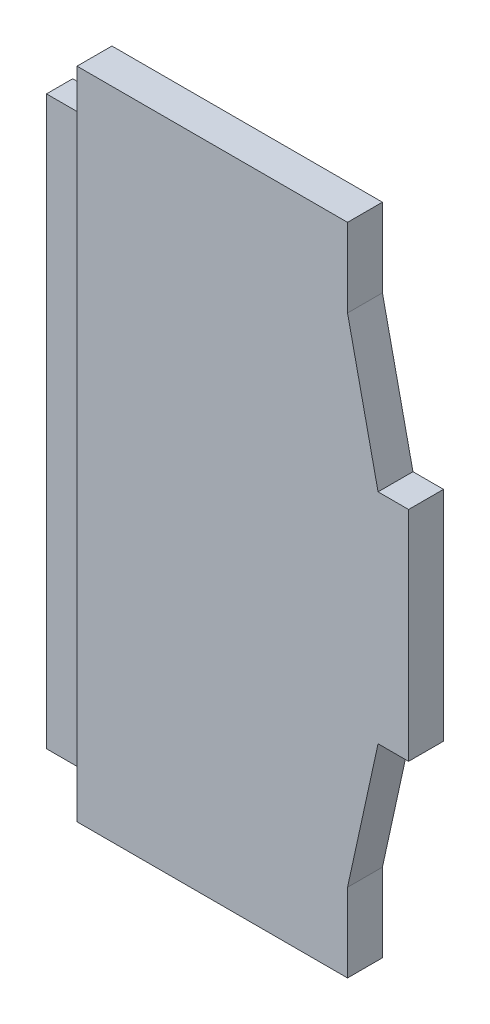
ISO-10303-21;
HEADER;
FILE_DESCRIPTION(('STEP AP214'),'2;1');
FILE_NAME('part.step','',(''),(''),'','','');
FILE_SCHEMA(('AUTOMOTIVE_DESIGN { 1 0 10303 214 1 1 1 1 }'));
ENDSEC;
DATA;
#1=APPLICATION_CONTEXT('core data for automotive mechanical design processes');
#2=APPLICATION_PROTOCOL_DEFINITION('international standard','automotive_design',2000,#1);
#3=PRODUCT_CONTEXT('',#1,'mechanical');
#4=PRODUCT('Part','Part','',(#3));
#5=PRODUCT_RELATED_PRODUCT_CATEGORY('part','',(#4));
#6=PRODUCT_DEFINITION_FORMATION('','',#4);
#7=PRODUCT_DEFINITION_CONTEXT('part definition',#1,'design');
#8=PRODUCT_DEFINITION('design','',#6,#7);
#9=PRODUCT_DEFINITION_SHAPE('','',#8);
#10=(LENGTH_UNIT() NAMED_UNIT(*) SI_UNIT(.MILLI.,.METRE.));
#11=(NAMED_UNIT(*) PLANE_ANGLE_UNIT() SI_UNIT($,.RADIAN.));
#12=(NAMED_UNIT(*) SI_UNIT($,.STERADIAN.) SOLID_ANGLE_UNIT());
#13=UNCERTAINTY_MEASURE_WITH_UNIT(LENGTH_MEASURE(1.E-05),#10,'distance_accuracy_value','');
#14=(GEOMETRIC_REPRESENTATION_CONTEXT(3) GLOBAL_UNCERTAINTY_ASSIGNED_CONTEXT((#13)) GLOBAL_UNIT_ASSIGNED_CONTEXT((#10,
#11,#12)) REPRESENTATION_CONTEXT('',''));
#15=CARTESIAN_POINT('',(0.,0.,0.));
#16=DIRECTION('',(0.,0.,1.));
#17=DIRECTION('',(1.,0.,0.));
#18=AXIS2_PLACEMENT_3D('',#15,#16,#17);
#19=CARTESIAN_POINT('',(0.,0.,4.));
#20=DIRECTION('',(1.,0.,0.));
#21=DIRECTION('',(0.,0.,-1.));
#22=AXIS2_PLACEMENT_3D('',#19,#20,#21);
#23=PLANE('',#22);
#24=DIRECTION('',(0.,-1.,0.));
#25=VECTOR('',#24,1.);
#26=CARTESIAN_POINT('',(0.,0.,0.));
#27=LINE('',#26,#25);
#28=CARTESIAN_POINT('',(0.,75.,0.));
#29=VERTEX_POINT('',#28);
#30=CARTESIAN_POINT('',(0.,0.,0.));
#31=VERTEX_POINT('',#30);
#32=EDGE_CURVE('E163',#29,#31,#27,.T.);
#33=ORIENTED_EDGE('',*,*,#32,.T.);
#34=DIRECTION('',(0.,0.,-1.));
#35=VECTOR('',#34,1.);
#36=CARTESIAN_POINT('',(0.,0.,4.));
#37=LINE('',#36,#35);
#38=CARTESIAN_POINT('',(0.,0.,4.));
#39=VERTEX_POINT('',#38);
#40=EDGE_CURVE('E11',#39,#31,#37,.T.);
#41=ORIENTED_EDGE('',*,*,#40,.F.);
#42=DIRECTION('',(0.,-1.,0.));
#43=VECTOR('',#42,1.);
#44=CARTESIAN_POINT('',(0.,0.,4.));
#45=LINE('',#44,#43);
#46=CARTESIAN_POINT('',(0.,75.,4.));
#47=VERTEX_POINT('',#46);
#48=EDGE_CURVE('E174',#47,#39,#45,.T.);
#49=ORIENTED_EDGE('',*,*,#48,.F.);
#50=DIRECTION('',(0.,0.,-1.));
#51=VECTOR('',#50,1.);
#52=CARTESIAN_POINT('',(0.,75.,4.));
#53=LINE('',#52,#51);
#54=EDGE_CURVE('E205',#47,#29,#53,.T.);
#55=ORIENTED_EDGE('',*,*,#54,.T.);
#56=EDGE_LOOP('',(#33,#41,#49,#55));
#57=FACE_BOUND('',#56,.T.);
#58=DIRECTION('',(0.,-1.,0.));
#59=VECTOR('',#58,1.);
#60=CARTESIAN_POINT('',(0.,70.,0.500000000000006));
#61=LINE('',#60,#59);
#62=CARTESIAN_POINT('',(0.,70.,0.500000000000006));
#63=VERTEX_POINT('',#62);
#64=CARTESIAN_POINT('',(0.,4.99999999999999,0.500000000000006));
#65=VERTEX_POINT('',#64);
#66=EDGE_CURVE('E54',#63,#65,#61,.T.);
#67=ORIENTED_EDGE('',*,*,#66,.F.);
#68=DIRECTION('',(0.,0.,-1.));
#69=VECTOR('',#68,1.);
#70=CARTESIAN_POINT('',(0.,70.,0.500000000000006));
#71=LINE('',#70,#69);
#72=CARTESIAN_POINT('',(0.,70.,3.49999999999999));
#73=VERTEX_POINT('',#72);
#74=EDGE_CURVE('E58',#73,#63,#71,.T.);
#75=ORIENTED_EDGE('',*,*,#74,.F.);
#76=DIRECTION('',(0.,1.,0.));
#77=VECTOR('',#76,1.);
#78=CARTESIAN_POINT('',(0.,70.,3.49999999999999));
#79=LINE('',#78,#77);
#80=CARTESIAN_POINT('',(0.,4.99999999999999,3.50000000000001));
#81=VERTEX_POINT('',#80);
#82=EDGE_CURVE('E447',#81,#73,#79,.T.);
#83=ORIENTED_EDGE('',*,*,#82,.F.);
#84=DIRECTION('',(0.,0.,1.));
#85=VECTOR('',#84,1.);
#86=CARTESIAN_POINT('',(0.,4.99999999999999,0.500000000000006));
#87=LINE('',#86,#85);
#88=EDGE_CURVE('E457',#65,#81,#87,.T.);
#89=ORIENTED_EDGE('',*,*,#88,.F.);
#90=EDGE_LOOP('',(#67,#75,#83,#89));
#91=FACE_BOUND('',#90,.T.);
#92=ADVANCED_FACE('F39',(#57,#91),#23,.F.);
#93=CARTESIAN_POINT('',(0.,0.,4.));
#94=DIRECTION('',(0.,1.,0.));
#95=DIRECTION('',(0.,0.,1.));
#96=AXIS2_PLACEMENT_3D('',#93,#94,#95);
#97=PLANE('',#96);
#98=DIRECTION('',(1.,0.,0.));
#99=VECTOR('',#98,1.);
#100=CARTESIAN_POINT('',(0.,0.,0.));
#101=LINE('',#100,#99);
#102=CARTESIAN_POINT('',(31.,0.,0.));
#103=VERTEX_POINT('',#102);
#104=EDGE_CURVE('E168',#31,#103,#101,.T.);
#105=ORIENTED_EDGE('',*,*,#104,.T.);
#106=DIRECTION('',(0.,0.,-1.));
#107=VECTOR('',#106,1.);
#108=CARTESIAN_POINT('',(31.,0.,4.));
#109=LINE('',#108,#107);
#110=CARTESIAN_POINT('',(31.,0.,4.));
#111=VERTEX_POINT('',#110);
#112=EDGE_CURVE('E47',#111,#103,#109,.T.);
#113=ORIENTED_EDGE('',*,*,#112,.F.);
#114=DIRECTION('',(1.,0.,0.));
#115=VECTOR('',#114,1.);
#116=CARTESIAN_POINT('',(0.,0.,4.));
#117=LINE('',#116,#115);
#118=EDGE_CURVE('E178',#39,#111,#117,.T.);
#119=ORIENTED_EDGE('',*,*,#118,.F.);
#120=ORIENTED_EDGE('',*,*,#40,.T.);
#121=EDGE_LOOP('',(#105,#113,#119,#120));
#122=FACE_BOUND('',#121,.T.);
#123=ADVANCED_FACE('F291',(#122),#97,.F.);
#124=CARTESIAN_POINT('',(31.,0.,4.));
#125=DIRECTION('',(-1.,0.,0.));
#126=DIRECTION('',(0.,0.,1.));
#127=AXIS2_PLACEMENT_3D('',#124,#125,#126);
#128=PLANE('',#127);
#129=DIRECTION('',(0.,1.,0.));
#130=VECTOR('',#129,1.);
#131=CARTESIAN_POINT('',(31.,0.,0.));
#132=LINE('',#131,#130);
#133=CARTESIAN_POINT('',(31.,9.,0.));
#134=VERTEX_POINT('',#133);
#135=EDGE_CURVE('E209',#103,#134,#132,.T.);
#136=ORIENTED_EDGE('',*,*,#135,.T.);
#137=DIRECTION('',(0.,0.,-1.));
#138=VECTOR('',#137,1.);
#139=CARTESIAN_POINT('',(31.,9.,4.));
#140=LINE('',#139,#138);
#141=CARTESIAN_POINT('',(31.,9.,4.));
#142=VERTEX_POINT('',#141);
#143=EDGE_CURVE('E259',#142,#134,#140,.T.);
#144=ORIENTED_EDGE('',*,*,#143,.F.);
#145=DIRECTION('',(0.,1.,0.));
#146=VECTOR('',#145,1.);
#147=CARTESIAN_POINT('',(31.,0.,4.));
#148=LINE('',#147,#146);
#149=EDGE_CURVE('E182',#111,#142,#148,.T.);
#150=ORIENTED_EDGE('',*,*,#149,.F.);
#151=ORIENTED_EDGE('',*,*,#112,.T.);
#152=EDGE_LOOP('',(#136,#144,#150,#151));
#153=FACE_BOUND('',#152,.T.);
#154=ADVANCED_FACE('F268',(#153),#128,.F.);
#155=CARTESIAN_POINT('',(34.5,25.,4.));
#156=DIRECTION('',(-0.976900017396262,0.213696878805433,0.));
#157=DIRECTION('',(-0.213696878805433,-0.976900017396262,0.));
#158=AXIS2_PLACEMENT_3D('',#155,#156,#157);
#159=PLANE('',#158);
#160=DIRECTION('',(0.213696878805433,0.976900017396262,0.));
#161=VECTOR('',#160,1.);
#162=CARTESIAN_POINT('',(34.5,25.,0.));
#163=LINE('',#162,#161);
#164=CARTESIAN_POINT('',(34.5,25.,0.));
#165=VERTEX_POINT('',#164);
#166=EDGE_CURVE('E212',#134,#165,#163,.T.);
#167=ORIENTED_EDGE('',*,*,#166,.T.);
#168=DIRECTION('',(0.,0.,-1.));
#169=VECTOR('',#168,1.);
#170=CARTESIAN_POINT('',(34.5,25.,4.));
#171=LINE('',#170,#169);
#172=CARTESIAN_POINT('',(34.5,25.,4.));
#173=VERTEX_POINT('',#172);
#174=EDGE_CURVE('E255',#173,#165,#171,.T.);
#175=ORIENTED_EDGE('',*,*,#174,.F.);
#176=DIRECTION('',(0.213696878805433,0.976900017396262,0.));
#177=VECTOR('',#176,1.);
#178=CARTESIAN_POINT('',(34.5,25.,4.));
#179=LINE('',#178,#177);
#180=EDGE_CURVE('E185',#142,#173,#179,.T.);
#181=ORIENTED_EDGE('',*,*,#180,.F.);
#182=ORIENTED_EDGE('',*,*,#143,.T.);
#183=EDGE_LOOP('',(#167,#175,#181,#182));
#184=FACE_BOUND('',#183,.T.);
#185=ADVANCED_FACE('F279',(#184),#159,.F.);
#186=CARTESIAN_POINT('',(38.,25.,4.));
#187=DIRECTION('',(0.,1.,0.));
#188=DIRECTION('',(-1.,0.,0.));
#189=AXIS2_PLACEMENT_3D('',#186,#187,#188);
#190=PLANE('',#189);
#191=DIRECTION('',(1.,0.,0.));
#192=VECTOR('',#191,1.);
#193=CARTESIAN_POINT('',(38.,25.,0.));
#194=LINE('',#193,#192);
#195=CARTESIAN_POINT('',(38.,25.,0.));
#196=VERTEX_POINT('',#195);
#197=EDGE_CURVE('E215',#165,#196,#194,.T.);
#198=ORIENTED_EDGE('',*,*,#197,.T.);
#199=DIRECTION('',(0.,0.,-1.));
#200=VECTOR('',#199,1.);
#201=CARTESIAN_POINT('',(38.,25.,4.));
#202=LINE('',#201,#200);
#203=CARTESIAN_POINT('',(38.,25.,4.));
#204=VERTEX_POINT('',#203);
#205=EDGE_CURVE('E251',#204,#196,#202,.T.);
#206=ORIENTED_EDGE('',*,*,#205,.F.);
#207=DIRECTION('',(1.,0.,0.));
#208=VECTOR('',#207,1.);
#209=CARTESIAN_POINT('',(38.,25.,4.));
#210=LINE('',#209,#208);
#211=EDGE_CURVE('E188',#173,#204,#210,.T.);
#212=ORIENTED_EDGE('',*,*,#211,.F.);
#213=ORIENTED_EDGE('',*,*,#174,.T.);
#214=EDGE_LOOP('',(#198,#206,#212,#213));
#215=FACE_BOUND('',#214,.T.);
#216=ADVANCED_FACE('F283',(#215),#190,.F.);
#217=CARTESIAN_POINT('',(38.,50.,4.));
#218=DIRECTION('',(-1.,0.,0.));
#219=DIRECTION('',(0.,0.,1.));
#220=AXIS2_PLACEMENT_3D('',#217,#218,#219);
#221=PLANE('',#220);
#222=DIRECTION('',(0.,1.,0.));
#223=VECTOR('',#222,1.);
#224=CARTESIAN_POINT('',(38.,50.,0.));
#225=LINE('',#224,#223);
#226=CARTESIAN_POINT('',(38.,50.,0.));
#227=VERTEX_POINT('',#226);
#228=EDGE_CURVE('E218',#196,#227,#225,.T.);
#229=ORIENTED_EDGE('',*,*,#228,.T.);
#230=DIRECTION('',(0.,0.,-1.));
#231=VECTOR('',#230,1.);
#232=CARTESIAN_POINT('',(38.,50.,4.));
#233=LINE('',#232,#231);
#234=CARTESIAN_POINT('',(38.,50.,4.));
#235=VERTEX_POINT('',#234);
#236=EDGE_CURVE('E247',#235,#227,#233,.T.);
#237=ORIENTED_EDGE('',*,*,#236,.F.);
#238=DIRECTION('',(0.,1.,0.));
#239=VECTOR('',#238,1.);
#240=CARTESIAN_POINT('',(38.,50.,4.));
#241=LINE('',#240,#239);
#242=EDGE_CURVE('E191',#204,#235,#241,.T.);
#243=ORIENTED_EDGE('',*,*,#242,.F.);
#244=ORIENTED_EDGE('',*,*,#205,.T.);
#245=EDGE_LOOP('',(#229,#237,#243,#244));
#246=FACE_BOUND('',#245,.T.);
#247=ADVANCED_FACE('F314',(#246),#221,.F.);
#248=CARTESIAN_POINT('',(34.5,50.,4.));
#249=DIRECTION('',(0.,-1.,0.));
#250=DIRECTION('',(1.,0.,0.));
#251=AXIS2_PLACEMENT_3D('',#248,#249,#250);
#252=PLANE('',#251);
#253=DIRECTION('',(-1.,0.,0.));
#254=VECTOR('',#253,1.);
#255=CARTESIAN_POINT('',(34.5,50.,0.));
#256=LINE('',#255,#254);
#257=CARTESIAN_POINT('',(34.5,50.,0.));
#258=VERTEX_POINT('',#257);
#259=EDGE_CURVE('E221',#227,#258,#256,.T.);
#260=ORIENTED_EDGE('',*,*,#259,.T.);
#261=DIRECTION('',(0.,0.,-1.));
#262=VECTOR('',#261,1.);
#263=CARTESIAN_POINT('',(34.5,50.,4.));
#264=LINE('',#263,#262);
#265=CARTESIAN_POINT('',(34.5,50.,4.));
#266=VERTEX_POINT('',#265);
#267=EDGE_CURVE('E243',#266,#258,#264,.T.);
#268=ORIENTED_EDGE('',*,*,#267,.F.);
#269=DIRECTION('',(-1.,0.,0.));
#270=VECTOR('',#269,1.);
#271=CARTESIAN_POINT('',(34.5,50.,4.));
#272=LINE('',#271,#270);
#273=EDGE_CURVE('E194',#235,#266,#272,.T.);
#274=ORIENTED_EDGE('',*,*,#273,.F.);
#275=ORIENTED_EDGE('',*,*,#236,.T.);
#276=EDGE_LOOP('',(#260,#268,#274,#275));
#277=FACE_BOUND('',#276,.T.);
#278=ADVANCED_FACE('F311',(#277),#252,.F.);
#279=CARTESIAN_POINT('',(34.5,50.,4.));
#280=DIRECTION('',(-0.976900017396262,-0.213696878805433,0.));
#281=DIRECTION('',(0.213696878805433,-0.976900017396262,0.));
#282=AXIS2_PLACEMENT_3D('',#279,#280,#281);
#283=PLANE('',#282);
#284=DIRECTION('',(-0.213696878805433,0.976900017396262,0.));
#285=VECTOR('',#284,1.);
#286=CARTESIAN_POINT('',(34.5,50.,0.));
#287=LINE('',#286,#285);
#288=CARTESIAN_POINT('',(31.,66.,0.));
#289=VERTEX_POINT('',#288);
#290=EDGE_CURVE('E224',#258,#289,#287,.T.);
#291=ORIENTED_EDGE('',*,*,#290,.T.);
#292=DIRECTION('',(0.,0.,-1.));
#293=VECTOR('',#292,1.);
#294=CARTESIAN_POINT('',(31.,66.,4.));
#295=LINE('',#294,#293);
#296=CARTESIAN_POINT('',(31.,66.,4.));
#297=VERTEX_POINT('',#296);
#298=EDGE_CURVE('E239',#297,#289,#295,.T.);
#299=ORIENTED_EDGE('',*,*,#298,.F.);
#300=DIRECTION('',(-0.213696878805433,0.976900017396262,0.));
#301=VECTOR('',#300,1.);
#302=CARTESIAN_POINT('',(34.5,50.,4.));
#303=LINE('',#302,#301);
#304=EDGE_CURVE('E197',#266,#297,#303,.T.);
#305=ORIENTED_EDGE('',*,*,#304,.F.);
#306=ORIENTED_EDGE('',*,*,#267,.T.);
#307=EDGE_LOOP('',(#291,#299,#305,#306));
#308=FACE_BOUND('',#307,.T.);
#309=ADVANCED_FACE('F307',(#308),#283,.F.);
#310=CARTESIAN_POINT('',(31.,66.,4.));
#311=DIRECTION('',(-1.,0.,0.));
#312=DIRECTION('',(0.,0.,1.));
#313=AXIS2_PLACEMENT_3D('',#310,#311,#312);
#314=PLANE('',#313);
#315=DIRECTION('',(0.,1.,0.));
#316=VECTOR('',#315,1.);
#317=CARTESIAN_POINT('',(31.,66.,0.));
#318=LINE('',#317,#316);
#319=CARTESIAN_POINT('',(31.,75.,0.));
#320=VERTEX_POINT('',#319);
#321=EDGE_CURVE('E227',#289,#320,#318,.T.);
#322=ORIENTED_EDGE('',*,*,#321,.T.);
#323=DIRECTION('',(0.,0.,-1.));
#324=VECTOR('',#323,1.);
#325=CARTESIAN_POINT('',(31.,75.,4.));
#326=LINE('',#325,#324);
#327=CARTESIAN_POINT('',(31.,75.,4.));
#328=VERTEX_POINT('',#327);
#329=EDGE_CURVE('E235',#328,#320,#326,.T.);
#330=ORIENTED_EDGE('',*,*,#329,.F.);
#331=DIRECTION('',(0.,1.,0.));
#332=VECTOR('',#331,1.);
#333=CARTESIAN_POINT('',(31.,66.,4.));
#334=LINE('',#333,#332);
#335=EDGE_CURVE('E200',#297,#328,#334,.T.);
#336=ORIENTED_EDGE('',*,*,#335,.F.);
#337=ORIENTED_EDGE('',*,*,#298,.T.);
#338=EDGE_LOOP('',(#322,#330,#336,#337));
#339=FACE_BOUND('',#338,.T.);
#340=ADVANCED_FACE('F303',(#339),#314,.F.);
#341=CARTESIAN_POINT('',(0.,75.,4.));
#342=DIRECTION('',(0.,-1.,0.));
#343=DIRECTION('',(1.,0.,0.));
#344=AXIS2_PLACEMENT_3D('',#341,#342,#343);
#345=PLANE('',#344);
#346=DIRECTION('',(-1.,0.,0.));
#347=VECTOR('',#346,1.);
#348=CARTESIAN_POINT('',(0.,75.,0.));
#349=LINE('',#348,#347);
#350=EDGE_CURVE('E179',#320,#29,#349,.T.);
#351=ORIENTED_EDGE('',*,*,#350,.T.);
#352=ORIENTED_EDGE('',*,*,#54,.F.);
#353=DIRECTION('',(-1.,0.,0.));
#354=VECTOR('',#353,1.);
#355=CARTESIAN_POINT('',(0.,75.,4.));
#356=LINE('',#355,#354);
#357=EDGE_CURVE('E203',#328,#47,#356,.T.);
#358=ORIENTED_EDGE('',*,*,#357,.F.);
#359=ORIENTED_EDGE('',*,*,#329,.T.);
#360=EDGE_LOOP('',(#351,#352,#358,#359));
#361=FACE_BOUND('',#360,.T.);
#362=ADVANCED_FACE('F298',(#361),#345,.F.);
#363=CARTESIAN_POINT('',(0.,0.,4.));
#364=DIRECTION('',(0.,0.,-1.));
#365=DIRECTION('',(-1.,0.,0.));
#366=AXIS2_PLACEMENT_3D('',#363,#364,#365);
#367=PLANE('',#366);
#368=ORIENTED_EDGE('',*,*,#48,.T.);
#369=ORIENTED_EDGE('',*,*,#118,.T.);
#370=ORIENTED_EDGE('',*,*,#149,.T.);
#371=ORIENTED_EDGE('',*,*,#180,.T.);
#372=ORIENTED_EDGE('',*,*,#211,.T.);
#373=ORIENTED_EDGE('',*,*,#242,.T.);
#374=ORIENTED_EDGE('',*,*,#273,.T.);
#375=ORIENTED_EDGE('',*,*,#304,.T.);
#376=ORIENTED_EDGE('',*,*,#335,.T.);
#377=ORIENTED_EDGE('',*,*,#357,.T.);
#378=EDGE_LOOP('',(#368,#369,#370,#371,#372,#373,#374,#375,#376,#377));
#379=FACE_BOUND('',#378,.T.);
#380=ADVANCED_FACE('F287',(#379),#367,.F.);
#381=CARTESIAN_POINT('',(0.,0.,0.));
#382=DIRECTION('',(0.,0.,-1.));
#383=DIRECTION('',(-1.,0.,0.));
#384=AXIS2_PLACEMENT_3D('',#381,#382,#383);
#385=PLANE('',#384);
#386=ORIENTED_EDGE('',*,*,#32,.F.);
#387=ORIENTED_EDGE('',*,*,#350,.F.);
#388=ORIENTED_EDGE('',*,*,#321,.F.);
#389=ORIENTED_EDGE('',*,*,#290,.F.);
#390=ORIENTED_EDGE('',*,*,#259,.F.);
#391=ORIENTED_EDGE('',*,*,#228,.F.);
#392=ORIENTED_EDGE('',*,*,#197,.F.);
#393=ORIENTED_EDGE('',*,*,#166,.F.);
#394=ORIENTED_EDGE('',*,*,#135,.F.);
#395=ORIENTED_EDGE('',*,*,#104,.F.);
#396=EDGE_LOOP('',(#386,#387,#388,#389,#390,#391,#392,#393,#394,#395));
#397=FACE_BOUND('',#396,.T.);
#398=ADVANCED_FACE('F274',(#397),#385,.T.);
#399=CARTESIAN_POINT('',(-4.,70.,0.500000000000006));
#400=DIRECTION('',(0.,0.,1.));
#401=DIRECTION('',(1.,0.,0.));
#402=AXIS2_PLACEMENT_3D('',#399,#400,#401);
#403=PLANE('',#402);
#404=ORIENTED_EDGE('',*,*,#66,.T.);
#405=DIRECTION('',(1.,0.,0.));
#406=VECTOR('',#405,1.);
#407=CARTESIAN_POINT('',(-4.,4.99999999999999,0.500000000000006));
#408=LINE('',#407,#406);
#409=CARTESIAN_POINT('',(-4.,4.99999999999999,0.500000000000006));
#410=VERTEX_POINT('',#409);
#411=EDGE_CURVE('E143',#410,#65,#408,.T.);
#412=ORIENTED_EDGE('',*,*,#411,.F.);
#413=DIRECTION('',(0.,-1.,0.));
#414=VECTOR('',#413,1.);
#415=CARTESIAN_POINT('',(-4.,70.,0.500000000000006));
#416=LINE('',#415,#414);
#417=CARTESIAN_POINT('',(-4.,70.,0.500000000000006));
#418=VERTEX_POINT('',#417);
#419=EDGE_CURVE('E150',#418,#410,#416,.T.);
#420=ORIENTED_EDGE('',*,*,#419,.F.);
#421=DIRECTION('',(1.,0.,0.));
#422=VECTOR('',#421,1.);
#423=CARTESIAN_POINT('',(-4.,70.,0.500000000000006));
#424=LINE('',#423,#422);
#425=EDGE_CURVE('E444',#418,#63,#424,.T.);
#426=ORIENTED_EDGE('',*,*,#425,.T.);
#427=EDGE_LOOP('',(#404,#412,#420,#426));
#428=FACE_BOUND('',#427,.T.);
#429=ADVANCED_FACE('F161',(#428),#403,.F.);
#430=CARTESIAN_POINT('',(-4.,4.99999999999999,0.500000000000006));
#431=DIRECTION('',(0.,1.,0.));
#432=DIRECTION('',(0.,0.,1.));
#433=AXIS2_PLACEMENT_3D('',#430,#431,#432);
#434=PLANE('',#433);
#435=ORIENTED_EDGE('',*,*,#88,.T.);
#436=DIRECTION('',(1.,0.,0.));
#437=VECTOR('',#436,1.);
#438=CARTESIAN_POINT('',(-4.,4.99999999999999,3.50000000000001));
#439=LINE('',#438,#437);
#440=CARTESIAN_POINT('',(-4.,4.99999999999999,3.50000000000001));
#441=VERTEX_POINT('',#440);
#442=EDGE_CURVE('E145',#441,#81,#439,.T.);
#443=ORIENTED_EDGE('',*,*,#442,.F.);
#444=DIRECTION('',(0.,0.,1.));
#445=VECTOR('',#444,1.);
#446=CARTESIAN_POINT('',(-4.,4.99999999999999,0.500000000000006));
#447=LINE('',#446,#445);
#448=EDGE_CURVE('E138',#410,#441,#447,.T.);
#449=ORIENTED_EDGE('',*,*,#448,.F.);
#450=ORIENTED_EDGE('',*,*,#411,.T.);
#451=EDGE_LOOP('',(#435,#443,#449,#450));
#452=FACE_BOUND('',#451,.T.);
#453=ADVANCED_FACE('F141',(#452),#434,.F.);
#454=CARTESIAN_POINT('',(-4.,70.,3.49999999999999));
#455=DIRECTION('',(0.,0.,-1.));
#456=DIRECTION('',(0.,1.,0.));
#457=AXIS2_PLACEMENT_3D('',#454,#455,#456);
#458=PLANE('',#457);
#459=ORIENTED_EDGE('',*,*,#82,.T.);
#460=DIRECTION('',(1.,0.,0.));
#461=VECTOR('',#460,1.);
#462=CARTESIAN_POINT('',(-4.,70.,3.49999999999999));
#463=LINE('',#462,#461);
#464=CARTESIAN_POINT('',(-4.,70.,3.49999999999999));
#465=VERTEX_POINT('',#464);
#466=EDGE_CURVE('E170',#465,#73,#463,.T.);
#467=ORIENTED_EDGE('',*,*,#466,.F.);
#468=DIRECTION('',(0.,1.,0.));
#469=VECTOR('',#468,1.);
#470=CARTESIAN_POINT('',(-4.,70.,3.49999999999999));
#471=LINE('',#470,#469);
#472=EDGE_CURVE('E149',#441,#465,#471,.T.);
#473=ORIENTED_EDGE('',*,*,#472,.F.);
#474=ORIENTED_EDGE('',*,*,#442,.T.);
#475=EDGE_LOOP('',(#459,#467,#473,#474));
#476=FACE_BOUND('',#475,.T.);
#477=ADVANCED_FACE('F412',(#476),#458,.F.);
#478=CARTESIAN_POINT('',(-4.,70.,0.500000000000006));
#479=DIRECTION('',(0.,-1.,0.));
#480=DIRECTION('',(0.,0.,-1.));
#481=AXIS2_PLACEMENT_3D('',#478,#479,#480);
#482=PLANE('',#481);
#483=ORIENTED_EDGE('',*,*,#74,.T.);
#484=ORIENTED_EDGE('',*,*,#425,.F.);
#485=DIRECTION('',(0.,0.,-1.));
#486=VECTOR('',#485,1.);
#487=CARTESIAN_POINT('',(-4.,70.,0.500000000000006));
#488=LINE('',#487,#486);
#489=EDGE_CURVE('E155',#465,#418,#488,.T.);
#490=ORIENTED_EDGE('',*,*,#489,.F.);
#491=ORIENTED_EDGE('',*,*,#466,.T.);
#492=EDGE_LOOP('',(#483,#484,#490,#491));
#493=FACE_BOUND('',#492,.T.);
#494=ADVANCED_FACE('F421',(#493),#482,.F.);
#495=CARTESIAN_POINT('',(-4.,0.,0.));
#496=DIRECTION('',(-1.,0.,0.));
#497=DIRECTION('',(0.,0.,1.));
#498=AXIS2_PLACEMENT_3D('',#495,#496,#497);
#499=PLANE('',#498);
#500=ORIENTED_EDGE('',*,*,#419,.T.);
#501=ORIENTED_EDGE('',*,*,#448,.T.);
#502=ORIENTED_EDGE('',*,*,#472,.T.);
#503=ORIENTED_EDGE('',*,*,#489,.T.);
#504=EDGE_LOOP('',(#500,#501,#502,#503));
#505=FACE_BOUND('',#504,.T.);
#506=ADVANCED_FACE('F153',(#505),#499,.T.);
#507=CLOSED_SHELL('',(#92,#123,#154,#185,#216,#247,#278,#309,#340,#362,#380,#398,#429,#453,#477,
#494,#506));
#508=MANIFOLD_SOLID_BREP('B2',#507);
#509=ADVANCED_BREP_SHAPE_REPRESENTATION('',(#18,#508),#14);
#510=SHAPE_DEFINITION_REPRESENTATION(#9,#509);
ENDSEC;
END-ISO-10303-21;
